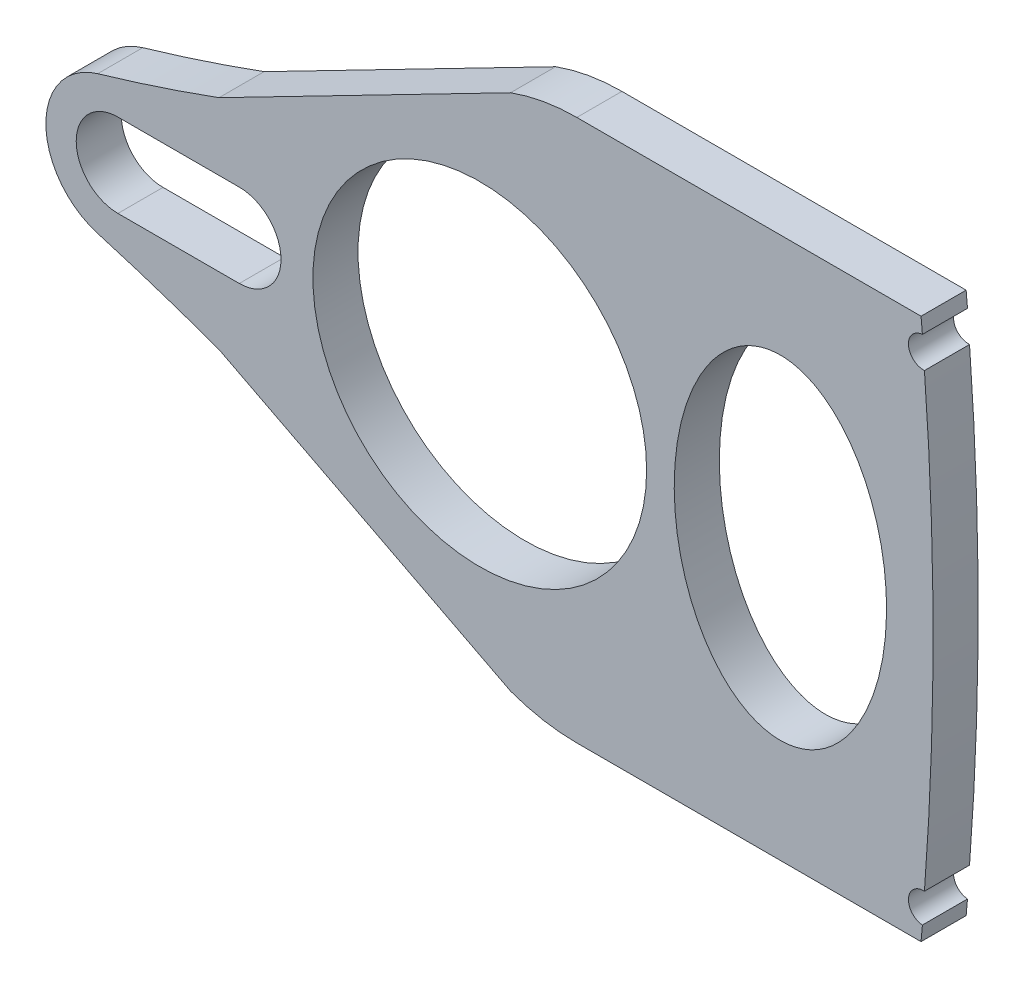
ISO-10303-21;
HEADER;
FILE_DESCRIPTION(('STEP AP214'),'2;1');
FILE_NAME('part.step','',(''),(''),'','','');
FILE_SCHEMA(('AUTOMOTIVE_DESIGN { 1 0 10303 214 1 1 1 1 }'));
ENDSEC;
DATA;
#1=APPLICATION_CONTEXT('core data for automotive mechanical design processes');
#2=APPLICATION_PROTOCOL_DEFINITION('international standard','automotive_design',2000,#1);
#3=PRODUCT_CONTEXT('',#1,'mechanical');
#4=PRODUCT('Part','Part','',(#3));
#5=PRODUCT_RELATED_PRODUCT_CATEGORY('part','',(#4));
#6=PRODUCT_DEFINITION_FORMATION('','',#4);
#7=PRODUCT_DEFINITION_CONTEXT('part definition',#1,'design');
#8=PRODUCT_DEFINITION('design','',#6,#7);
#9=PRODUCT_DEFINITION_SHAPE('','',#8);
#10=(LENGTH_UNIT() NAMED_UNIT(*) SI_UNIT(.MILLI.,.METRE.));
#11=(NAMED_UNIT(*) PLANE_ANGLE_UNIT() SI_UNIT($,.RADIAN.));
#12=(NAMED_UNIT(*) SI_UNIT($,.STERADIAN.) SOLID_ANGLE_UNIT());
#13=UNCERTAINTY_MEASURE_WITH_UNIT(LENGTH_MEASURE(1.E-05),#10,'distance_accuracy_value','');
#14=(GEOMETRIC_REPRESENTATION_CONTEXT(3) GLOBAL_UNCERTAINTY_ASSIGNED_CONTEXT((#13)) GLOBAL_UNIT_ASSIGNED_CONTEXT((#10,
#11,#12)) REPRESENTATION_CONTEXT('',''));
#15=CARTESIAN_POINT('',(0.,0.,0.));
#16=DIRECTION('',(0.,0.,1.));
#17=DIRECTION('',(1.,0.,0.));
#18=AXIS2_PLACEMENT_3D('',#15,#16,#17);
#19=CARTESIAN_POINT('',(-7.77682333282368,-8.07860975328582,3.));
#20=DIRECTION('',(0.,0.,-1.));
#21=DIRECTION('',(-1.,0.,0.));
#22=AXIS2_PLACEMENT_3D('',#19,#20,#21);
#23=PLANE('',#22);
#24=CARTESIAN_POINT('',(-37.3047240677871,7.92909578834775,3.));
#25=DIRECTION('',(0.,0.,1.));
#26=DIRECTION('',(1.,0.,0.));
#27=AXIS2_PLACEMENT_3D('',#24,#25,#26);
#28=CIRCLE('',#27,11.101085899709);
#29=CARTESIAN_POINT('',(-26.203638168078,7.92909578834775,3.));
#30=VERTEX_POINT('',#29);
#31=EDGE_CURVE('E222',#30,#30,#28,.T.);
#32=ORIENTED_EDGE('',*,*,#31,.F.);
#33=EDGE_LOOP('',(#32));
#34=FACE_BOUND('',#33,.T.);
#35=CARTESIAN_POINT('',(-7.77682333282368,-8.07860975328582,3.));
#36=DIRECTION('',(0.,0.,-1.));
#37=DIRECTION('',(-1.,0.,0.));
#38=AXIS2_PLACEMENT_3D('',#35,#36,#37);
#39=CIRCLE('',#38,1.00918962724148);
#40=CARTESIAN_POINT('',(-7.85750176930527,-9.08456934174785,3.));
#41=VERTEX_POINT('',#40);
#42=CARTESIAN_POINT('',(-7.72211277540757,-7.07090421165238,3.));
#43=VERTEX_POINT('',#42);
#44=EDGE_CURVE('E230',#41,#43,#39,.T.);
#45=ORIENTED_EDGE('',*,*,#44,.T.);
#46=CARTESIAN_POINT('',(-202.995006498992,7.92909578834775,3.));
#47=DIRECTION('',(0.,0.,1.));
#48=DIRECTION('',(1.,0.,0.));
#49=AXIS2_PLACEMENT_3D('',#46,#47,#48);
#50=CIRCLE('',#49,195.848163185622);
#51=CARTESIAN_POINT('',(-7.72211277540757,22.9290957883478,3.));
#52=VERTEX_POINT('',#51);
#53=EDGE_CURVE('E234',#43,#52,#50,.T.);
#54=ORIENTED_EDGE('',*,*,#53,.T.);
#55=CARTESIAN_POINT('',(-7.77682333282464,23.9368013299813,3.));
#56=DIRECTION('',(0.,0.,-1.));
#57=DIRECTION('',(1.,0.,0.));
#58=AXIS2_PLACEMENT_3D('',#55,#56,#57);
#59=CIRCLE('',#58,1.00918962724148);
#60=CARTESIAN_POINT('',(-7.85750176930527,24.9427609184434,3.));
#61=VERTEX_POINT('',#60);
#62=EDGE_CURVE('E238',#52,#61,#59,.T.);
#63=ORIENTED_EDGE('',*,*,#62,.T.);
#64=CARTESIAN_POINT('',(-202.995006498993,7.92909578834775,3.));
#65=DIRECTION('',(0.,0.,1.));
#66=DIRECTION('',(1.,0.,0.));
#67=AXIS2_PLACEMENT_3D('',#64,#65,#66);
#68=CIRCLE('',#67,195.877794946972);
#69=CARTESIAN_POINT('',(-7.9477487809832,25.9479140063167,3.));
#70=VERTEX_POINT('',#69);
#71=EDGE_CURVE('E241',#61,#70,#68,.T.);
#72=ORIENTED_EDGE('',*,*,#71,.T.);
#73=DIRECTION('',(-0.999999998590368,5.30967382112141E-05,0.));
#74=VECTOR('',#73,1.);
#75=CARTESIAN_POINT('',(-7.94774878098322,25.9479140063167,3.));
#76=LINE('',#75,#74);
#77=CARTESIAN_POINT('',(-30.8487465878278,25.9491299746037,3.));
#78=VERTEX_POINT('',#77);
#79=EDGE_CURVE('E244',#70,#78,#76,.T.);
#80=ORIENTED_EDGE('',*,*,#79,.T.);
#81=CARTESIAN_POINT('',(-30.8487465878266,13.1324217085756,3.));
#82=DIRECTION('',(0.,0.,1.));
#83=DIRECTION('',(1.,0.,0.));
#84=AXIS2_PLACEMENT_3D('',#81,#82,#83);
#85=CIRCLE('',#84,12.8167082660281);
#86=CARTESIAN_POINT('',(-35.25464235117,25.1680394035269,3.));
#87=VERTEX_POINT('',#86);
#88=EDGE_CURVE('E247',#78,#87,#85,.T.);
#89=ORIENTED_EDGE('',*,*,#88,.T.);
#90=DIRECTION('',(-0.889156967005642,-0.457602325196593,0.));
#91=VECTOR('',#90,1.);
#92=CARTESIAN_POINT('',(-35.25464235117,25.1680394035269,3.));
#93=LINE('',#92,#91);
#94=CARTESIAN_POINT('',(-54.6534028909261,15.1845176426634,3.));
#95=VERTEX_POINT('',#94);
#96=EDGE_CURVE('E250',#87,#95,#93,.T.);
#97=ORIENTED_EDGE('',*,*,#96,.T.);
#98=CARTESIAN_POINT('',(-98.7123605242545,135.540694592211,3.));
#99=DIRECTION('',(0.,0.,-1.));
#100=DIRECTION('',(1.,0.,0.));
#101=AXIS2_PLACEMENT_3D('',#98,#99,#100);
#102=CIRCLE('',#101,128.167082660277);
#103=CARTESIAN_POINT('',(-62.7242529820178,12.5298934681851,3.));
#104=VERTEX_POINT('',#103);
#105=EDGE_CURVE('E253',#95,#104,#102,.T.);
#106=ORIENTED_EDGE('',*,*,#105,.T.);
#107=CARTESIAN_POINT('',(-61.3782410857581,7.92909578834775,3.));
#108=DIRECTION('',(0.,0.,1.));
#109=DIRECTION('',(1.,0.,0.));
#110=AXIS2_PLACEMENT_3D('',#107,#108,#109);
#111=CIRCLE('',#110,4.79365072942003);
#112=CARTESIAN_POINT('',(-62.7242529820177,3.3282981085104,3.));
#113=VERTEX_POINT('',#112);
#114=EDGE_CURVE('E256',#104,#113,#111,.T.);
#115=ORIENTED_EDGE('',*,*,#114,.T.);
#116=CARTESIAN_POINT('',(-98.7123605242545,-119.682503015516,3.));
#117=DIRECTION('',(0.,0.,-1.));
#118=DIRECTION('',(-1.,0.,0.));
#119=AXIS2_PLACEMENT_3D('',#116,#117,#118);
#120=CIRCLE('',#119,128.167082660277);
#121=CARTESIAN_POINT('',(-54.6534028909261,0.673673934032157,3.));
#122=VERTEX_POINT('',#121);
#123=EDGE_CURVE('E259',#113,#122,#120,.T.);
#124=ORIENTED_EDGE('',*,*,#123,.T.);
#125=DIRECTION('',(0.889156967005634,-0.457602325196607,0.));
#126=VECTOR('',#125,1.);
#127=CARTESIAN_POINT('',(-35.2546423511701,-9.30984782683175,3.));
#128=LINE('',#127,#126);
#129=CARTESIAN_POINT('',(-35.2546423511701,-9.30984782683175,3.));
#130=VERTEX_POINT('',#129);
#131=EDGE_CURVE('E262',#122,#130,#128,.T.);
#132=ORIENTED_EDGE('',*,*,#131,.T.);
#133=CARTESIAN_POINT('',(-30.8487465878266,2.7257698681199,3.));
#134=DIRECTION('',(0.,0.,1.));
#135=DIRECTION('',(-1.,0.,0.));
#136=AXIS2_PLACEMENT_3D('',#133,#134,#135);
#137=CIRCLE('',#136,12.8167082660281);
#138=CARTESIAN_POINT('',(-30.8487465878278,-10.0909383979082,3.));
#139=VERTEX_POINT('',#138);
#140=EDGE_CURVE('E265',#130,#139,#137,.T.);
#141=ORIENTED_EDGE('',*,*,#140,.T.);
#142=DIRECTION('',(0.999999998590368,5.30967381959129E-05,0.));
#143=VECTOR('',#142,1.);
#144=CARTESIAN_POINT('',(-7.94774878098322,-10.0897224296212,3.));
#145=LINE('',#144,#143);
#146=CARTESIAN_POINT('',(-7.94774878098322,-10.0897224296212,3.));
#147=VERTEX_POINT('',#146);
#148=EDGE_CURVE('E268',#139,#147,#145,.T.);
#149=ORIENTED_EDGE('',*,*,#148,.T.);
#150=CARTESIAN_POINT('',(-202.995006498993,7.92909578834775,3.));
#151=DIRECTION('',(0.,0.,1.));
#152=DIRECTION('',(-1.,0.,0.));
#153=AXIS2_PLACEMENT_3D('',#150,#151,#152);
#154=CIRCLE('',#153,195.877794946972);
#155=EDGE_CURVE('E271',#147,#41,#154,.T.);
#156=ORIENTED_EDGE('',*,*,#155,.T.);
#157=EDGE_LOOP('',(#45,#54,#63,#72,#80,#89,#97,#106,#115,#124,#132,#141,#149,#156));
#158=FACE_BOUND('',#157,.T.);
#159=CARTESIAN_POINT('',(-53.3047240677871,7.92909578834775,3.));
#160=DIRECTION('',(0.,0.,1.));
#161=DIRECTION('',(1.,0.,0.));
#162=AXIS2_PLACEMENT_3D('',#159,#160,#161);
#163=CIRCLE('',#162,2.77527147492789);
#164=CARTESIAN_POINT('',(-53.3047240677882,5.15382431341987,3.));
#165=VERTEX_POINT('',#164);
#166=CARTESIAN_POINT('',(-53.3047240677882,10.7043672632756,3.));
#167=VERTEX_POINT('',#166);
#168=EDGE_CURVE('E171',#165,#167,#163,.T.);
#169=ORIENTED_EDGE('',*,*,#168,.F.);
#170=DIRECTION('',(1.,0.,0.));
#171=VECTOR('',#170,1.);
#172=CARTESIAN_POINT('',(-61.3782410857584,5.15382431342025,3.));
#173=LINE('',#172,#171);
#174=CARTESIAN_POINT('',(-61.3782410857584,5.15382431342025,3.));
#175=VERTEX_POINT('',#174);
#176=EDGE_CURVE('E198',#175,#165,#173,.T.);
#177=ORIENTED_EDGE('',*,*,#176,.F.);
#178=CARTESIAN_POINT('',(-61.3782410857581,7.92909578834775,3.));
#179=DIRECTION('',(0.,0.,1.));
#180=DIRECTION('',(1.,0.,0.));
#181=AXIS2_PLACEMENT_3D('',#178,#179,#180);
#182=CIRCLE('',#181,2.7752714749275);
#183=CARTESIAN_POINT('',(-61.3782410857584,10.7043672632753,3.));
#184=VERTEX_POINT('',#183);
#185=EDGE_CURVE('E194',#184,#175,#182,.T.);
#186=ORIENTED_EDGE('',*,*,#185,.F.);
#187=DIRECTION('',(-1.,0.,0.));
#188=VECTOR('',#187,1.);
#189=CARTESIAN_POINT('',(-61.3782410857584,10.7043672632753,3.));
#190=LINE('',#189,#188);
#191=EDGE_CURVE('E180',#167,#184,#190,.T.);
#192=ORIENTED_EDGE('',*,*,#191,.F.);
#193=EDGE_LOOP('',(#169,#177,#186,#192));
#194=FACE_BOUND('',#193,.T.);
#195=CARTESIAN_POINT('',(-17.3047240677871,7.92909578834775,3.));
#196=DIRECTION('',(0.,0.,1.));
#197=DIRECTION('',(0.,-1.,0.));
#198=AXIS2_PLACEMENT_3D('',#195,#196,#197);
#199=ELLIPSE('',#198,11.101085899709,7.06432739072393);
#200=CARTESIAN_POINT('',(-17.304724067787,-3.17199011136129,3.));
#201=VERTEX_POINT('',#200);
#202=EDGE_CURVE('E206',#201,#201,#199,.T.);
#203=ORIENTED_EDGE('',*,*,#202,.F.);
#204=EDGE_LOOP('',(#203));
#205=FACE_BOUND('',#204,.T.);
#206=ADVANCED_FACE('F45',(#34,#158,#194,#205),#23,.F.);
#207=CARTESIAN_POINT('',(-7.77682333282368,-8.07860975328582,0.));
#208=DIRECTION('',(0.,0.,-1.));
#209=DIRECTION('',(-1.,0.,0.));
#210=AXIS2_PLACEMENT_3D('',#207,#208,#209);
#211=PLANE('',#210);
#212=DIRECTION('',(1.,0.,0.));
#213=VECTOR('',#212,1.);
#214=CARTESIAN_POINT('',(-61.3782410857584,5.15382431342025,0.));
#215=LINE('',#214,#213);
#216=CARTESIAN_POINT('',(-61.3782410857584,5.15382431342025,0.));
#217=VERTEX_POINT('',#216);
#218=CARTESIAN_POINT('',(-53.3047240677882,5.15382431341987,0.));
#219=VERTEX_POINT('',#218);
#220=EDGE_CURVE('E181',#217,#219,#215,.T.);
#221=ORIENTED_EDGE('',*,*,#220,.T.);
#222=CARTESIAN_POINT('',(-53.3047240677871,7.92909578834775,0.));
#223=DIRECTION('',(0.,0.,1.));
#224=DIRECTION('',(1.,0.,0.));
#225=AXIS2_PLACEMENT_3D('',#222,#223,#224);
#226=CIRCLE('',#225,2.77527147492789);
#227=CARTESIAN_POINT('',(-53.3047240677882,10.7043672632756,0.));
#228=VERTEX_POINT('',#227);
#229=EDGE_CURVE('E69',#219,#228,#226,.T.);
#230=ORIENTED_EDGE('',*,*,#229,.T.);
#231=DIRECTION('',(-1.,0.,0.));
#232=VECTOR('',#231,1.);
#233=CARTESIAN_POINT('',(-61.3782410857584,10.7043672632753,0.));
#234=LINE('',#233,#232);
#235=CARTESIAN_POINT('',(-61.3782410857584,10.7043672632753,0.));
#236=VERTEX_POINT('',#235);
#237=EDGE_CURVE('E187',#228,#236,#234,.T.);
#238=ORIENTED_EDGE('',*,*,#237,.T.);
#239=CARTESIAN_POINT('',(-61.3782410857581,7.92909578834775,0.));
#240=DIRECTION('',(0.,0.,1.));
#241=DIRECTION('',(1.,0.,0.));
#242=AXIS2_PLACEMENT_3D('',#239,#240,#241);
#243=CIRCLE('',#242,2.7752714749275);
#244=EDGE_CURVE('E209',#236,#217,#243,.T.);
#245=ORIENTED_EDGE('',*,*,#244,.T.);
#246=EDGE_LOOP('',(#221,#230,#238,#245));
#247=FACE_BOUND('',#246,.T.);
#248=CARTESIAN_POINT('',(-37.3047240677871,7.92909578834775,0.));
#249=DIRECTION('',(0.,0.,1.));
#250=DIRECTION('',(1.,0.,0.));
#251=AXIS2_PLACEMENT_3D('',#248,#249,#250);
#252=CIRCLE('',#251,11.101085899709);
#253=CARTESIAN_POINT('',(-26.203638168078,7.92909578834775,0.));
#254=VERTEX_POINT('',#253);
#255=EDGE_CURVE('E189',#254,#254,#252,.T.);
#256=ORIENTED_EDGE('',*,*,#255,.T.);
#257=EDGE_LOOP('',(#256));
#258=FACE_BOUND('',#257,.T.);
#259=CARTESIAN_POINT('',(-202.995006498992,7.92909578834775,0.));
#260=DIRECTION('',(0.,0.,1.));
#261=DIRECTION('',(1.,0.,0.));
#262=AXIS2_PLACEMENT_3D('',#259,#260,#261);
#263=CIRCLE('',#262,195.848163185622);
#264=CARTESIAN_POINT('',(-7.72211277540757,-7.07090421165238,0.));
#265=VERTEX_POINT('',#264);
#266=CARTESIAN_POINT('',(-7.72211277540757,22.9290957883478,0.));
#267=VERTEX_POINT('',#266);
#268=EDGE_CURVE('E226',#265,#267,#263,.T.);
#269=ORIENTED_EDGE('',*,*,#268,.F.);
#270=CARTESIAN_POINT('',(-7.77682333282368,-8.07860975328582,0.));
#271=DIRECTION('',(0.,0.,-1.));
#272=DIRECTION('',(-1.,0.,0.));
#273=AXIS2_PLACEMENT_3D('',#270,#271,#272);
#274=CIRCLE('',#273,1.0091896272415);
#275=CARTESIAN_POINT('',(-7.85750176930527,-9.08456934174785,0.));
#276=VERTEX_POINT('',#275);
#277=EDGE_CURVE('E235',#276,#265,#274,.T.);
#278=ORIENTED_EDGE('',*,*,#277,.F.);
#279=CARTESIAN_POINT('',(-202.995006498993,7.92909578834775,0.));
#280=DIRECTION('',(0.,0.,1.));
#281=DIRECTION('',(-1.,0.,0.));
#282=AXIS2_PLACEMENT_3D('',#279,#280,#281);
#283=CIRCLE('',#282,195.877794946972);
#284=CARTESIAN_POINT('',(-7.94774878098322,-10.0897224296212,0.));
#285=VERTEX_POINT('',#284);
#286=EDGE_CURVE('E312',#285,#276,#283,.T.);
#287=ORIENTED_EDGE('',*,*,#286,.F.);
#288=DIRECTION('',(0.999999998590368,5.30967381959129E-05,0.));
#289=VECTOR('',#288,1.);
#290=CARTESIAN_POINT('',(-7.94774878098322,-10.0897224296212,0.));
#291=LINE('',#290,#289);
#292=CARTESIAN_POINT('',(-30.8487465878278,-10.0909383979082,0.));
#293=VERTEX_POINT('',#292);
#294=EDGE_CURVE('E309',#293,#285,#291,.T.);
#295=ORIENTED_EDGE('',*,*,#294,.F.);
#296=CARTESIAN_POINT('',(-30.8487465878266,2.7257698681199,0.));
#297=DIRECTION('',(0.,0.,1.));
#298=DIRECTION('',(-1.,0.,0.));
#299=AXIS2_PLACEMENT_3D('',#296,#297,#298);
#300=CIRCLE('',#299,12.8167082660281);
#301=CARTESIAN_POINT('',(-35.2546423511701,-9.30984782683175,0.));
#302=VERTEX_POINT('',#301);
#303=EDGE_CURVE('E306',#302,#293,#300,.T.);
#304=ORIENTED_EDGE('',*,*,#303,.F.);
#305=DIRECTION('',(0.889156967005634,-0.457602325196607,0.));
#306=VECTOR('',#305,1.);
#307=CARTESIAN_POINT('',(-35.2546423511701,-9.30984782683175,0.));
#308=LINE('',#307,#306);
#309=CARTESIAN_POINT('',(-54.6534028909261,0.673673934032157,0.));
#310=VERTEX_POINT('',#309);
#311=EDGE_CURVE('E303',#310,#302,#308,.T.);
#312=ORIENTED_EDGE('',*,*,#311,.F.);
#313=CARTESIAN_POINT('',(-98.7123605242545,-119.682503015516,0.));
#314=DIRECTION('',(0.,0.,-1.));
#315=DIRECTION('',(-1.,0.,0.));
#316=AXIS2_PLACEMENT_3D('',#313,#314,#315);
#317=CIRCLE('',#316,128.167082660277);
#318=CARTESIAN_POINT('',(-62.7242529820177,3.3282981085104,0.));
#319=VERTEX_POINT('',#318);
#320=EDGE_CURVE('E300',#319,#310,#317,.T.);
#321=ORIENTED_EDGE('',*,*,#320,.F.);
#322=CARTESIAN_POINT('',(-61.3782410857581,7.92909578834775,0.));
#323=DIRECTION('',(0.,0.,1.));
#324=DIRECTION('',(1.,0.,0.));
#325=AXIS2_PLACEMENT_3D('',#322,#323,#324);
#326=CIRCLE('',#325,4.79365072942003);
#327=CARTESIAN_POINT('',(-62.7242529820178,12.5298934681851,0.));
#328=VERTEX_POINT('',#327);
#329=EDGE_CURVE('E297',#328,#319,#326,.T.);
#330=ORIENTED_EDGE('',*,*,#329,.F.);
#331=CARTESIAN_POINT('',(-98.7123605242545,135.540694592211,0.));
#332=DIRECTION('',(0.,0.,-1.));
#333=DIRECTION('',(1.,0.,0.));
#334=AXIS2_PLACEMENT_3D('',#331,#332,#333);
#335=CIRCLE('',#334,128.167082660277);
#336=CARTESIAN_POINT('',(-54.6534028909261,15.1845176426634,0.));
#337=VERTEX_POINT('',#336);
#338=EDGE_CURVE('E294',#337,#328,#335,.T.);
#339=ORIENTED_EDGE('',*,*,#338,.F.);
#340=DIRECTION('',(-0.889156967005642,-0.457602325196593,0.));
#341=VECTOR('',#340,1.);
#342=CARTESIAN_POINT('',(-35.25464235117,25.1680394035269,0.));
#343=LINE('',#342,#341);
#344=CARTESIAN_POINT('',(-35.25464235117,25.1680394035269,0.));
#345=VERTEX_POINT('',#344);
#346=EDGE_CURVE('E291',#345,#337,#343,.T.);
#347=ORIENTED_EDGE('',*,*,#346,.F.);
#348=CARTESIAN_POINT('',(-30.8487465878266,13.1324217085756,0.));
#349=DIRECTION('',(0.,0.,1.));
#350=DIRECTION('',(1.,0.,0.));
#351=AXIS2_PLACEMENT_3D('',#348,#349,#350);
#352=CIRCLE('',#351,12.8167082660281);
#353=CARTESIAN_POINT('',(-30.8487465878278,25.9491299746037,0.));
#354=VERTEX_POINT('',#353);
#355=EDGE_CURVE('E288',#354,#345,#352,.T.);
#356=ORIENTED_EDGE('',*,*,#355,.F.);
#357=DIRECTION('',(-0.999999998590368,5.30967382112141E-05,0.));
#358=VECTOR('',#357,1.);
#359=CARTESIAN_POINT('',(-7.94774878098322,25.9479140063167,0.));
#360=LINE('',#359,#358);
#361=CARTESIAN_POINT('',(-7.9477487809832,25.9479140063167,0.));
#362=VERTEX_POINT('',#361);
#363=EDGE_CURVE('E285',#362,#354,#360,.T.);
#364=ORIENTED_EDGE('',*,*,#363,.F.);
#365=CARTESIAN_POINT('',(-202.995006498993,7.92909578834775,0.));
#366=DIRECTION('',(0.,0.,1.));
#367=DIRECTION('',(1.,0.,0.));
#368=AXIS2_PLACEMENT_3D('',#365,#366,#367);
#369=CIRCLE('',#368,195.877794946972);
#370=CARTESIAN_POINT('',(-7.85750176930527,24.9427609184434,0.));
#371=VERTEX_POINT('',#370);
#372=EDGE_CURVE('E282',#371,#362,#369,.T.);
#373=ORIENTED_EDGE('',*,*,#372,.F.);
#374=CARTESIAN_POINT('',(-7.77682333282464,23.9368013299813,0.));
#375=DIRECTION('',(0.,0.,-1.));
#376=DIRECTION('',(1.,0.,0.));
#377=AXIS2_PLACEMENT_3D('',#374,#375,#376);
#378=CIRCLE('',#377,1.00918962724148);
#379=EDGE_CURVE('E279',#267,#371,#378,.T.);
#380=ORIENTED_EDGE('',*,*,#379,.F.);
#381=EDGE_LOOP('',(#269,#278,#287,#295,#304,#312,#321,#330,#339,#347,#356,#364,#373,#380));
#382=FACE_BOUND('',#381,.T.);
#383=CARTESIAN_POINT('',(-17.3047240677871,7.92909578834775,0.));
#384=DIRECTION('',(0.,0.,1.));
#385=DIRECTION('',(0.,-1.,0.));
#386=AXIS2_PLACEMENT_3D('',#383,#384,#385);
#387=ELLIPSE('',#386,11.101085899709,7.06432739072393);
#388=CARTESIAN_POINT('',(-17.304724067787,-3.17199011136129,0.));
#389=VERTEX_POINT('',#388);
#390=EDGE_CURVE('E630',#389,#389,#387,.T.);
#391=ORIENTED_EDGE('',*,*,#390,.T.);
#392=EDGE_LOOP('',(#391));
#393=FACE_BOUND('',#392,.T.);
#394=ADVANCED_FACE('F375',(#247,#258,#382,#393),#211,.T.);
#395=CARTESIAN_POINT('',(-202.995006498992,7.92909578834775,3.));
#396=DIRECTION('',(0.,0.,-1.));
#397=DIRECTION('',(-1.,0.,0.));
#398=AXIS2_PLACEMENT_3D('',#395,#396,#397);
#399=CYLINDRICAL_SURFACE('',#398,195.848163185622);
#400=ORIENTED_EDGE('',*,*,#268,.T.);
#401=DIRECTION('',(0.,0.,-1.));
#402=VECTOR('',#401,1.);
#403=CARTESIAN_POINT('',(-7.72211277540757,22.9290957883478,3.));
#404=LINE('',#403,#402);
#405=EDGE_CURVE('E54',#52,#267,#404,.T.);
#406=ORIENTED_EDGE('',*,*,#405,.F.);
#407=ORIENTED_EDGE('',*,*,#53,.F.);
#408=DIRECTION('',(0.,0.,-1.));
#409=VECTOR('',#408,1.);
#410=CARTESIAN_POINT('',(-7.72211277540757,-7.07090421165238,3.));
#411=LINE('',#410,#409);
#412=EDGE_CURVE('E11',#43,#265,#411,.T.);
#413=ORIENTED_EDGE('',*,*,#412,.T.);
#414=EDGE_LOOP('',(#400,#406,#407,#413));
#415=FACE_BOUND('',#414,.T.);
#416=ADVANCED_FACE('F47',(#415),#399,.T.);
#417=CARTESIAN_POINT('',(-7.77682333282464,23.9368013299813,3.));
#418=DIRECTION('',(0.,0.,-1.));
#419=DIRECTION('',(-1.,0.,0.));
#420=AXIS2_PLACEMENT_3D('',#417,#418,#419);
#421=CYLINDRICAL_SURFACE('',#420,1.00918962724148);
#422=ORIENTED_EDGE('',*,*,#379,.T.);
#423=DIRECTION('',(0.,0.,-1.));
#424=VECTOR('',#423,1.);
#425=CARTESIAN_POINT('',(-7.85750176930527,24.9427609184434,3.));
#426=LINE('',#425,#424);
#427=EDGE_CURVE('E360',#61,#371,#426,.T.);
#428=ORIENTED_EDGE('',*,*,#427,.F.);
#429=ORIENTED_EDGE('',*,*,#62,.F.);
#430=ORIENTED_EDGE('',*,*,#405,.T.);
#431=EDGE_LOOP('',(#422,#428,#429,#430));
#432=FACE_BOUND('',#431,.T.);
#433=ADVANCED_FACE('F368',(#432),#421,.F.);
#434=CARTESIAN_POINT('',(-202.995006498993,7.92909578834775,3.));
#435=DIRECTION('',(0.,0.,-1.));
#436=DIRECTION('',(-1.,0.,0.));
#437=AXIS2_PLACEMENT_3D('',#434,#435,#436);
#438=CYLINDRICAL_SURFACE('',#437,195.877794946972);
#439=ORIENTED_EDGE('',*,*,#372,.T.);
#440=DIRECTION('',(0.,0.,-1.));
#441=VECTOR('',#440,1.);
#442=CARTESIAN_POINT('',(-7.9477487809832,25.9479140063167,3.));
#443=LINE('',#442,#441);
#444=EDGE_CURVE('E356',#70,#362,#443,.T.);
#445=ORIENTED_EDGE('',*,*,#444,.F.);
#446=ORIENTED_EDGE('',*,*,#71,.F.);
#447=ORIENTED_EDGE('',*,*,#427,.T.);
#448=EDGE_LOOP('',(#439,#445,#446,#447));
#449=FACE_BOUND('',#448,.T.);
#450=ADVANCED_FACE('F383',(#449),#438,.T.);
#451=CARTESIAN_POINT('',(-7.94774878098322,25.9479140063167,3.));
#452=DIRECTION('',(-5.30967382112141E-05,-0.999999998590368,0.));
#453=DIRECTION('',(0.999999998590368,-5.30967382112141E-05,0.));
#454=AXIS2_PLACEMENT_3D('',#451,#452,#453);
#455=PLANE('',#454);
#456=ORIENTED_EDGE('',*,*,#363,.T.);
#457=DIRECTION('',(0.,0.,-1.));
#458=VECTOR('',#457,1.);
#459=CARTESIAN_POINT('',(-30.8487465878278,25.9491299746037,3.));
#460=LINE('',#459,#458);
#461=EDGE_CURVE('E352',#78,#354,#460,.T.);
#462=ORIENTED_EDGE('',*,*,#461,.F.);
#463=ORIENTED_EDGE('',*,*,#79,.F.);
#464=ORIENTED_EDGE('',*,*,#444,.T.);
#465=EDGE_LOOP('',(#456,#462,#463,#464));
#466=FACE_BOUND('',#465,.T.);
#467=ADVANCED_FACE('F387',(#466),#455,.F.);
#468=CARTESIAN_POINT('',(-30.8487465878266,13.1324217085756,3.));
#469=DIRECTION('',(0.,0.,-1.));
#470=DIRECTION('',(-1.,0.,0.));
#471=AXIS2_PLACEMENT_3D('',#468,#469,#470);
#472=CYLINDRICAL_SURFACE('',#471,12.8167082660281);
#473=ORIENTED_EDGE('',*,*,#355,.T.);
#474=DIRECTION('',(0.,0.,-1.));
#475=VECTOR('',#474,1.);
#476=CARTESIAN_POINT('',(-35.25464235117,25.1680394035269,3.));
#477=LINE('',#476,#475);
#478=EDGE_CURVE('E348',#87,#345,#477,.T.);
#479=ORIENTED_EDGE('',*,*,#478,.F.);
#480=ORIENTED_EDGE('',*,*,#88,.F.);
#481=ORIENTED_EDGE('',*,*,#461,.T.);
#482=EDGE_LOOP('',(#473,#479,#480,#481));
#483=FACE_BOUND('',#482,.T.);
#484=ADVANCED_FACE('F434',(#483),#472,.T.);
#485=CARTESIAN_POINT('',(-35.25464235117,25.1680394035269,3.));
#486=DIRECTION('',(0.457602325196593,-0.889156967005642,0.));
#487=DIRECTION('',(0.889156967005642,0.457602325196593,0.));
#488=AXIS2_PLACEMENT_3D('',#485,#486,#487);
#489=PLANE('',#488);
#490=ORIENTED_EDGE('',*,*,#346,.T.);
#491=DIRECTION('',(0.,0.,-1.));
#492=VECTOR('',#491,1.);
#493=CARTESIAN_POINT('',(-54.6534028909261,15.1845176426634,3.));
#494=LINE('',#493,#492);
#495=EDGE_CURVE('E344',#95,#337,#494,.T.);
#496=ORIENTED_EDGE('',*,*,#495,.F.);
#497=ORIENTED_EDGE('',*,*,#96,.F.);
#498=ORIENTED_EDGE('',*,*,#478,.T.);
#499=EDGE_LOOP('',(#490,#496,#497,#498));
#500=FACE_BOUND('',#499,.T.);
#501=ADVANCED_FACE('F431',(#500),#489,.F.);
#502=CARTESIAN_POINT('',(-98.7123605242545,135.540694592211,3.));
#503=DIRECTION('',(0.,0.,-1.));
#504=DIRECTION('',(-1.,0.,0.));
#505=AXIS2_PLACEMENT_3D('',#502,#503,#504);
#506=CYLINDRICAL_SURFACE('',#505,128.167082660277);
#507=ORIENTED_EDGE('',*,*,#338,.T.);
#508=DIRECTION('',(0.,0.,-1.));
#509=VECTOR('',#508,1.);
#510=CARTESIAN_POINT('',(-62.7242529820178,12.5298934681851,3.));
#511=LINE('',#510,#509);
#512=EDGE_CURVE('E340',#104,#328,#511,.T.);
#513=ORIENTED_EDGE('',*,*,#512,.F.);
#514=ORIENTED_EDGE('',*,*,#105,.F.);
#515=ORIENTED_EDGE('',*,*,#495,.T.);
#516=EDGE_LOOP('',(#507,#513,#514,#515));
#517=FACE_BOUND('',#516,.T.);
#518=ADVANCED_FACE('F427',(#517),#506,.F.);
#519=CARTESIAN_POINT('',(-61.3782410857581,7.92909578834775,3.));
#520=DIRECTION('',(0.,0.,-1.));
#521=DIRECTION('',(-1.,0.,0.));
#522=AXIS2_PLACEMENT_3D('',#519,#520,#521);
#523=CYLINDRICAL_SURFACE('',#522,4.79365072942003);
#524=ORIENTED_EDGE('',*,*,#329,.T.);
#525=DIRECTION('',(0.,0.,-1.));
#526=VECTOR('',#525,1.);
#527=CARTESIAN_POINT('',(-62.7242529820177,3.3282981085104,3.));
#528=LINE('',#527,#526);
#529=EDGE_CURVE('E336',#113,#319,#528,.T.);
#530=ORIENTED_EDGE('',*,*,#529,.F.);
#531=ORIENTED_EDGE('',*,*,#114,.F.);
#532=ORIENTED_EDGE('',*,*,#512,.T.);
#533=EDGE_LOOP('',(#524,#530,#531,#532));
#534=FACE_BOUND('',#533,.T.);
#535=ADVANCED_FACE('F423',(#534),#523,.T.);
#536=CARTESIAN_POINT('',(-98.7123605242545,-119.682503015516,3.));
#537=DIRECTION('',(0.,0.,-1.));
#538=DIRECTION('',(-1.,0.,0.));
#539=AXIS2_PLACEMENT_3D('',#536,#537,#538);
#540=CYLINDRICAL_SURFACE('',#539,128.167082660277);
#541=ORIENTED_EDGE('',*,*,#320,.T.);
#542=DIRECTION('',(0.,0.,-1.));
#543=VECTOR('',#542,1.);
#544=CARTESIAN_POINT('',(-54.6534028909261,0.673673934032157,3.));
#545=LINE('',#544,#543);
#546=EDGE_CURVE('E332',#122,#310,#545,.T.);
#547=ORIENTED_EDGE('',*,*,#546,.F.);
#548=ORIENTED_EDGE('',*,*,#123,.F.);
#549=ORIENTED_EDGE('',*,*,#529,.T.);
#550=EDGE_LOOP('',(#541,#547,#548,#549));
#551=FACE_BOUND('',#550,.T.);
#552=ADVANCED_FACE('F418',(#551),#540,.F.);
#553=CARTESIAN_POINT('',(-35.2546423511701,-9.30984782683175,3.));
#554=DIRECTION('',(0.457602325196607,0.889156967005634,0.));
#555=DIRECTION('',(-0.889156967005634,0.457602325196607,0.));
#556=AXIS2_PLACEMENT_3D('',#553,#554,#555);
#557=PLANE('',#556);
#558=ORIENTED_EDGE('',*,*,#311,.T.);
#559=DIRECTION('',(0.,0.,-1.));
#560=VECTOR('',#559,1.);
#561=CARTESIAN_POINT('',(-35.2546423511701,-9.30984782683175,3.));
#562=LINE('',#561,#560);
#563=EDGE_CURVE('E328',#130,#302,#562,.T.);
#564=ORIENTED_EDGE('',*,*,#563,.F.);
#565=ORIENTED_EDGE('',*,*,#131,.F.);
#566=ORIENTED_EDGE('',*,*,#546,.T.);
#567=EDGE_LOOP('',(#558,#564,#565,#566));
#568=FACE_BOUND('',#567,.T.);
#569=ADVANCED_FACE('F412',(#568),#557,.F.);
#570=CARTESIAN_POINT('',(-30.8487465878266,2.7257698681199,3.));
#571=DIRECTION('',(0.,0.,-1.));
#572=DIRECTION('',(-1.,0.,0.));
#573=AXIS2_PLACEMENT_3D('',#570,#571,#572);
#574=CYLINDRICAL_SURFACE('',#573,12.8167082660281);
#575=ORIENTED_EDGE('',*,*,#303,.T.);
#576=DIRECTION('',(0.,0.,-1.));
#577=VECTOR('',#576,1.);
#578=CARTESIAN_POINT('',(-30.8487465878278,-10.0909383979082,3.));
#579=LINE('',#578,#577);
#580=EDGE_CURVE('E324',#139,#293,#579,.T.);
#581=ORIENTED_EDGE('',*,*,#580,.F.);
#582=ORIENTED_EDGE('',*,*,#140,.F.);
#583=ORIENTED_EDGE('',*,*,#563,.T.);
#584=EDGE_LOOP('',(#575,#581,#582,#583));
#585=FACE_BOUND('',#584,.T.);
#586=ADVANCED_FACE('F408',(#585),#574,.T.);
#587=CARTESIAN_POINT('',(-7.94774878098322,-10.0897224296212,3.));
#588=DIRECTION('',(-5.30967381959129E-05,0.999999998590368,0.));
#589=DIRECTION('',(-0.999999998590368,-5.30967381959129E-05,0.));
#590=AXIS2_PLACEMENT_3D('',#587,#588,#589);
#591=PLANE('',#590);
#592=ORIENTED_EDGE('',*,*,#294,.T.);
#593=DIRECTION('',(0.,0.,-1.));
#594=VECTOR('',#593,1.);
#595=CARTESIAN_POINT('',(-7.94774878098322,-10.0897224296212,3.));
#596=LINE('',#595,#594);
#597=EDGE_CURVE('E320',#147,#285,#596,.T.);
#598=ORIENTED_EDGE('',*,*,#597,.F.);
#599=ORIENTED_EDGE('',*,*,#148,.F.);
#600=ORIENTED_EDGE('',*,*,#580,.T.);
#601=EDGE_LOOP('',(#592,#598,#599,#600));
#602=FACE_BOUND('',#601,.T.);
#603=ADVANCED_FACE('F403',(#602),#591,.F.);
#604=CARTESIAN_POINT('',(-202.995006498993,7.92909578834775,3.));
#605=DIRECTION('',(0.,0.,-1.));
#606=DIRECTION('',(-1.,0.,0.));
#607=AXIS2_PLACEMENT_3D('',#604,#605,#606);
#608=CYLINDRICAL_SURFACE('',#607,195.877794946972);
#609=ORIENTED_EDGE('',*,*,#286,.T.);
#610=DIRECTION('',(0.,0.,-1.));
#611=VECTOR('',#610,1.);
#612=CARTESIAN_POINT('',(-7.85750176930527,-9.08456934174785,3.));
#613=LINE('',#612,#611);
#614=EDGE_CURVE('E275',#41,#276,#613,.T.);
#615=ORIENTED_EDGE('',*,*,#614,.F.);
#616=ORIENTED_EDGE('',*,*,#155,.F.);
#617=ORIENTED_EDGE('',*,*,#597,.T.);
#618=EDGE_LOOP('',(#609,#615,#616,#617));
#619=FACE_BOUND('',#618,.T.);
#620=ADVANCED_FACE('F397',(#619),#608,.T.);
#621=CARTESIAN_POINT('',(-7.77682333282368,-8.07860975328582,3.));
#622=DIRECTION('',(0.,0.,-1.));
#623=DIRECTION('',(-1.,0.,0.));
#624=AXIS2_PLACEMENT_3D('',#621,#622,#623);
#625=CYLINDRICAL_SURFACE('',#624,1.0091896272415);
#626=ORIENTED_EDGE('',*,*,#277,.T.);
#627=ORIENTED_EDGE('',*,*,#412,.F.);
#628=ORIENTED_EDGE('',*,*,#44,.F.);
#629=ORIENTED_EDGE('',*,*,#614,.T.);
#630=EDGE_LOOP('',(#626,#627,#628,#629));
#631=FACE_BOUND('',#630,.T.);
#632=ADVANCED_FACE('F395',(#631),#625,.F.);
#633=CARTESIAN_POINT('',(-37.3047240677871,7.92909578834775,3.));
#634=DIRECTION('',(0.,0.,-1.));
#635=DIRECTION('',(-1.,0.,0.));
#636=AXIS2_PLACEMENT_3D('',#633,#634,#635);
#637=CYLINDRICAL_SURFACE('',#636,11.101085899709);
#638=ORIENTED_EDGE('',*,*,#31,.T.);
#639=EDGE_LOOP('',(#638));
#640=FACE_BOUND('',#639,.T.);
#641=ORIENTED_EDGE('',*,*,#255,.F.);
#642=EDGE_LOOP('',(#641));
#643=FACE_BOUND('',#642,.T.);
#644=ADVANCED_FACE('F453',(#640,#643),#637,.F.);
#645=CARTESIAN_POINT('',(-53.3047240677871,7.92909578834775,3.));
#646=DIRECTION('',(0.,0.,-1.));
#647=DIRECTION('',(-1.,0.,0.));
#648=AXIS2_PLACEMENT_3D('',#645,#646,#647);
#649=CYLINDRICAL_SURFACE('',#648,2.77527147492789);
#650=ORIENTED_EDGE('',*,*,#229,.F.);
#651=DIRECTION('',(0.,0.,-1.));
#652=VECTOR('',#651,1.);
#653=CARTESIAN_POINT('',(-53.3047240677882,5.15382431341987,3.));
#654=LINE('',#653,#652);
#655=EDGE_CURVE('E175',#165,#219,#654,.T.);
#656=ORIENTED_EDGE('',*,*,#655,.F.);
#657=ORIENTED_EDGE('',*,*,#168,.T.);
#658=DIRECTION('',(0.,0.,-1.));
#659=VECTOR('',#658,1.);
#660=CARTESIAN_POINT('',(-53.3047240677882,10.7043672632756,3.));
#661=LINE('',#660,#659);
#662=EDGE_CURVE('E174',#167,#228,#661,.T.);
#663=ORIENTED_EDGE('',*,*,#662,.T.);
#664=EDGE_LOOP('',(#650,#656,#657,#663));
#665=FACE_BOUND('',#664,.T.);
#666=ADVANCED_FACE('F173',(#665),#649,.F.);
#667=CARTESIAN_POINT('',(-61.3782410857584,10.7043672632753,3.));
#668=DIRECTION('',(0.,-1.,0.));
#669=DIRECTION('',(1.,0.,0.));
#670=AXIS2_PLACEMENT_3D('',#667,#668,#669);
#671=PLANE('',#670);
#672=ORIENTED_EDGE('',*,*,#237,.F.);
#673=ORIENTED_EDGE('',*,*,#662,.F.);
#674=ORIENTED_EDGE('',*,*,#191,.T.);
#675=DIRECTION('',(0.,0.,-1.));
#676=VECTOR('',#675,1.);
#677=CARTESIAN_POINT('',(-61.3782410857584,10.7043672632753,3.));
#678=LINE('',#677,#676);
#679=EDGE_CURVE('E190',#184,#236,#678,.T.);
#680=ORIENTED_EDGE('',*,*,#679,.T.);
#681=EDGE_LOOP('',(#672,#673,#674,#680));
#682=FACE_BOUND('',#681,.T.);
#683=ADVANCED_FACE('F184',(#682),#671,.T.);
#684=CARTESIAN_POINT('',(-61.3782410857581,7.92909578834775,3.));
#685=DIRECTION('',(0.,0.,-1.));
#686=DIRECTION('',(-1.,0.,0.));
#687=AXIS2_PLACEMENT_3D('',#684,#685,#686);
#688=CYLINDRICAL_SURFACE('',#687,2.7752714749275);
#689=ORIENTED_EDGE('',*,*,#244,.F.);
#690=ORIENTED_EDGE('',*,*,#679,.F.);
#691=ORIENTED_EDGE('',*,*,#185,.T.);
#692=DIRECTION('',(0.,0.,-1.));
#693=VECTOR('',#692,1.);
#694=CARTESIAN_POINT('',(-61.3782410857584,5.15382431342025,3.));
#695=LINE('',#694,#693);
#696=EDGE_CURVE('E61',#175,#217,#695,.T.);
#697=ORIENTED_EDGE('',*,*,#696,.T.);
#698=EDGE_LOOP('',(#689,#690,#691,#697));
#699=FACE_BOUND('',#698,.T.);
#700=ADVANCED_FACE('F530',(#699),#688,.F.);
#701=CARTESIAN_POINT('',(-61.3782410857584,5.15382431342025,3.));
#702=DIRECTION('',(0.,1.,0.));
#703=DIRECTION('',(-1.,0.,0.));
#704=AXIS2_PLACEMENT_3D('',#701,#702,#703);
#705=PLANE('',#704);
#706=ORIENTED_EDGE('',*,*,#220,.F.);
#707=ORIENTED_EDGE('',*,*,#696,.F.);
#708=ORIENTED_EDGE('',*,*,#176,.T.);
#709=ORIENTED_EDGE('',*,*,#655,.T.);
#710=EDGE_LOOP('',(#706,#707,#708,#709));
#711=FACE_BOUND('',#710,.T.);
#712=ADVANCED_FACE('F538',(#711),#705,.T.);
#713=DIRECTION('',(0.,0.,-1.));
#714=VECTOR('',#713,1.);
#715=SURFACE_OF_LINEAR_EXTRUSION('',#199,#714);
#716=ORIENTED_EDGE('',*,*,#202,.T.);
#717=EDGE_LOOP('',(#716));
#718=FACE_BOUND('',#717,.T.);
#719=ORIENTED_EDGE('',*,*,#390,.F.);
#720=EDGE_LOOP('',(#719));
#721=FACE_BOUND('',#720,.T.);
#722=ADVANCED_FACE('F547',(#718,#721),#715,.T.);
#723=CLOSED_SHELL('',(#206,#394,#416,#433,#450,#467,#484,#501,#518,#535,#552,#569,#586,#603,
#620,#632,#644,#666,#683,#700,#712,#722));
#724=MANIFOLD_SOLID_BREP('B2',#723);
#725=ADVANCED_BREP_SHAPE_REPRESENTATION('',(#18,#724),#14);
#726=SHAPE_DEFINITION_REPRESENTATION(#9,#725);
ENDSEC;
END-ISO-10303-21;
